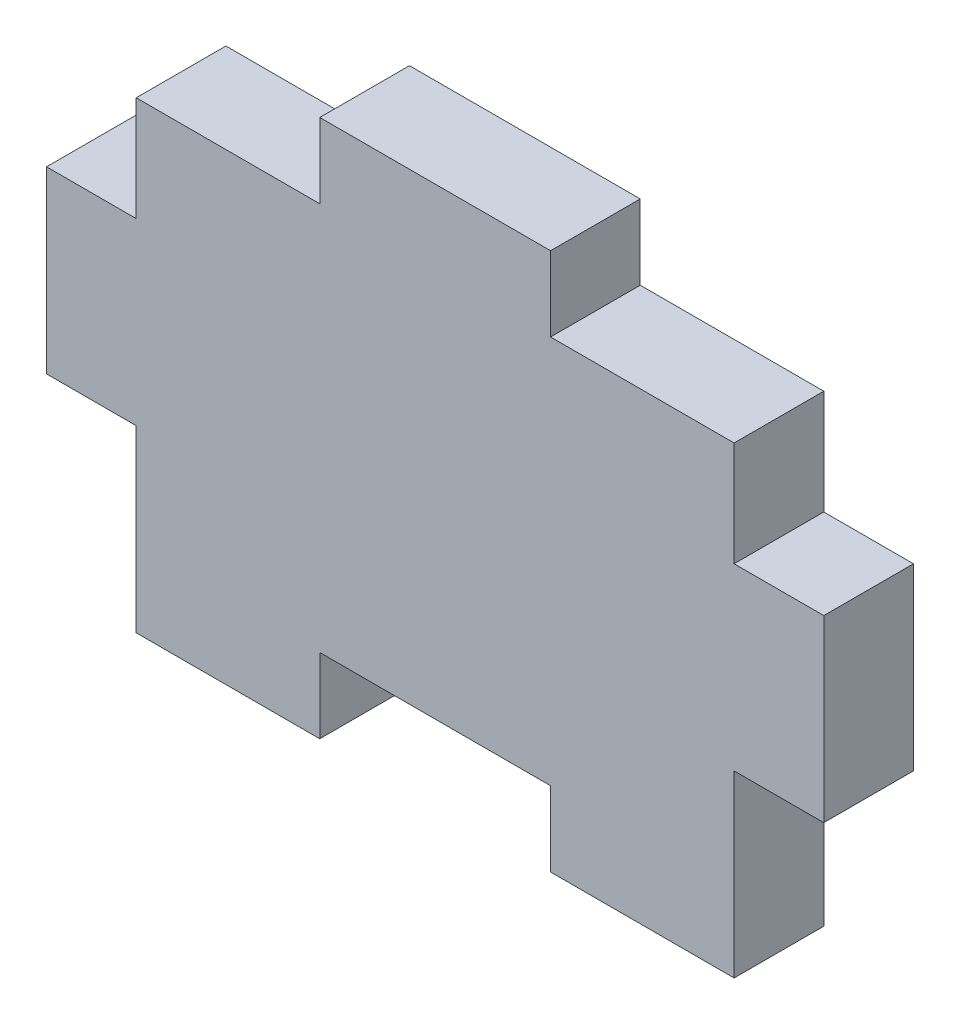
ISO-10303-21;
HEADER;
FILE_DESCRIPTION(('STEP AP214'),'2;1');
FILE_NAME('part.step','',(''),(''),'','','');
FILE_SCHEMA(('AUTOMOTIVE_DESIGN { 1 0 10303 214 1 1 1 1 }'));
ENDSEC;
DATA;
#1=APPLICATION_CONTEXT('core data for automotive mechanical design processes');
#2=APPLICATION_PROTOCOL_DEFINITION('international standard','automotive_design',2000,#1);
#3=PRODUCT_CONTEXT('',#1,'mechanical');
#4=PRODUCT('Part','Part','',(#3));
#5=PRODUCT_RELATED_PRODUCT_CATEGORY('part','',(#4));
#6=PRODUCT_DEFINITION_FORMATION('','',#4);
#7=PRODUCT_DEFINITION_CONTEXT('part definition',#1,'design');
#8=PRODUCT_DEFINITION('design','',#6,#7);
#9=PRODUCT_DEFINITION_SHAPE('','',#8);
#10=(LENGTH_UNIT() NAMED_UNIT(*) SI_UNIT(.MILLI.,.METRE.));
#11=(NAMED_UNIT(*) PLANE_ANGLE_UNIT() SI_UNIT($,.RADIAN.));
#12=(NAMED_UNIT(*) SI_UNIT($,.STERADIAN.) SOLID_ANGLE_UNIT());
#13=UNCERTAINTY_MEASURE_WITH_UNIT(LENGTH_MEASURE(1.E-05),#10,'distance_accuracy_value','');
#14=(GEOMETRIC_REPRESENTATION_CONTEXT(3) GLOBAL_UNCERTAINTY_ASSIGNED_CONTEXT((#13)) GLOBAL_UNIT_ASSIGNED_CONTEXT((#10,
#11,#12)) REPRESENTATION_CONTEXT('',''));
#15=CARTESIAN_POINT('',(0.,0.,0.));
#16=DIRECTION('',(0.,0.,1.));
#17=DIRECTION('',(1.,0.,0.));
#18=AXIS2_PLACEMENT_3D('',#15,#16,#17);
#19=CARTESIAN_POINT('',(-10.,11.3810935461449,3.));
#20=DIRECTION('',(-1.,0.,0.));
#21=DIRECTION('',(0.,-1.,0.));
#22=AXIS2_PLACEMENT_3D('',#19,#20,#21);
#23=PLANE('',#22);
#24=DIRECTION('',(0.,1.,0.));
#25=VECTOR('',#24,1.);
#26=CARTESIAN_POINT('',(-10.,11.3810935461449,0.));
#27=LINE('',#26,#25);
#28=CARTESIAN_POINT('',(-10.,11.3810935461449,0.));
#29=VERTEX_POINT('',#28);
#30=CARTESIAN_POINT('',(-10.,14.8810935461449,0.));
#31=VERTEX_POINT('',#30);
#32=EDGE_CURVE('E213',#29,#31,#27,.T.);
#33=ORIENTED_EDGE('',*,*,#32,.F.);
#34=DIRECTION('',(0.,0.,-1.));
#35=VECTOR('',#34,1.);
#36=CARTESIAN_POINT('',(-10.,11.3810935461449,3.));
#37=LINE('',#36,#35);
#38=CARTESIAN_POINT('',(-10.,11.3810935461449,3.));
#39=VERTEX_POINT('',#38);
#40=EDGE_CURVE('E11',#39,#29,#37,.T.);
#41=ORIENTED_EDGE('',*,*,#40,.F.);
#42=DIRECTION('',(0.,1.,0.));
#43=VECTOR('',#42,1.);
#44=CARTESIAN_POINT('',(-10.,11.3810935461449,3.));
#45=LINE('',#44,#43);
#46=CARTESIAN_POINT('',(-10.,14.8810935461449,3.));
#47=VERTEX_POINT('',#46);
#48=EDGE_CURVE('E283',#39,#47,#45,.T.);
#49=ORIENTED_EDGE('',*,*,#48,.T.);
#50=DIRECTION('',(0.,0.,-1.));
#51=VECTOR('',#50,1.);
#52=CARTESIAN_POINT('',(-10.,14.8810935461449,3.));
#53=LINE('',#52,#51);
#54=EDGE_CURVE('E44',#47,#31,#53,.T.);
#55=ORIENTED_EDGE('',*,*,#54,.T.);
#56=EDGE_LOOP('',(#33,#41,#49,#55));
#57=FACE_BOUND('',#56,.T.);
#58=ADVANCED_FACE('F41',(#57),#23,.T.);
#59=CARTESIAN_POINT('',(-13.,11.3810935461449,3.));
#60=DIRECTION('',(0.,1.,0.));
#61=DIRECTION('',(0.,0.,1.));
#62=AXIS2_PLACEMENT_3D('',#59,#60,#61);
#63=PLANE('',#62);
#64=DIRECTION('',(1.,0.,0.));
#65=VECTOR('',#64,1.);
#66=CARTESIAN_POINT('',(-13.,11.3810935461449,0.));
#67=LINE('',#66,#65);
#68=CARTESIAN_POINT('',(-13.,11.3810935461449,0.));
#69=VERTEX_POINT('',#68);
#70=EDGE_CURVE('E280',#69,#29,#67,.T.);
#71=ORIENTED_EDGE('',*,*,#70,.F.);
#72=DIRECTION('',(0.,0.,-1.));
#73=VECTOR('',#72,1.);
#74=CARTESIAN_POINT('',(-13.,11.3810935461449,3.));
#75=LINE('',#74,#73);
#76=CARTESIAN_POINT('',(-13.,11.3810935461449,3.));
#77=VERTEX_POINT('',#76);
#78=EDGE_CURVE('E51',#77,#69,#75,.T.);
#79=ORIENTED_EDGE('',*,*,#78,.F.);
#80=DIRECTION('',(1.,0.,0.));
#81=VECTOR('',#80,1.);
#82=CARTESIAN_POINT('',(-13.,11.3810935461449,3.));
#83=LINE('',#82,#81);
#84=EDGE_CURVE('E206',#77,#39,#83,.T.);
#85=ORIENTED_EDGE('',*,*,#84,.T.);
#86=ORIENTED_EDGE('',*,*,#40,.T.);
#87=EDGE_LOOP('',(#71,#79,#85,#86));
#88=FACE_BOUND('',#87,.T.);
#89=ADVANCED_FACE('F343',(#88),#63,.T.);
#90=CARTESIAN_POINT('',(-13.,5.3810935461449,3.));
#91=DIRECTION('',(-1.,0.,0.));
#92=DIRECTION('',(0.,0.,1.));
#93=AXIS2_PLACEMENT_3D('',#90,#91,#92);
#94=PLANE('',#93);
#95=DIRECTION('',(0.,1.,0.));
#96=VECTOR('',#95,1.);
#97=CARTESIAN_POINT('',(-13.,5.3810935461449,0.));
#98=LINE('',#97,#96);
#99=CARTESIAN_POINT('',(-13.,5.3810935461449,0.));
#100=VERTEX_POINT('',#99);
#101=EDGE_CURVE('E189',#100,#69,#98,.T.);
#102=ORIENTED_EDGE('',*,*,#101,.F.);
#103=DIRECTION('',(0.,0.,-1.));
#104=VECTOR('',#103,1.);
#105=CARTESIAN_POINT('',(-13.,5.3810935461449,3.));
#106=LINE('',#105,#104);
#107=CARTESIAN_POINT('',(-13.,5.3810935461449,3.));
#108=VERTEX_POINT('',#107);
#109=EDGE_CURVE('E183',#108,#100,#106,.T.);
#110=ORIENTED_EDGE('',*,*,#109,.F.);
#111=DIRECTION('',(0.,1.,0.));
#112=VECTOR('',#111,1.);
#113=CARTESIAN_POINT('',(-13.,5.3810935461449,3.));
#114=LINE('',#113,#112);
#115=EDGE_CURVE('E187',#108,#77,#114,.T.);
#116=ORIENTED_EDGE('',*,*,#115,.T.);
#117=ORIENTED_EDGE('',*,*,#78,.T.);
#118=EDGE_LOOP('',(#102,#110,#116,#117));
#119=FACE_BOUND('',#118,.T.);
#120=ADVANCED_FACE('F185',(#119),#94,.T.);
#121=CARTESIAN_POINT('',(-13.,5.3810935461449,3.));
#122=DIRECTION('',(0.,1.,0.));
#123=DIRECTION('',(-1.,0.,0.));
#124=AXIS2_PLACEMENT_3D('',#121,#122,#123);
#125=PLANE('',#124);
#126=DIRECTION('',(1.,0.,0.));
#127=VECTOR('',#126,1.);
#128=CARTESIAN_POINT('',(-13.,5.3810935461449,0.));
#129=LINE('',#128,#127);
#130=CARTESIAN_POINT('',(-10.,5.3810935461449,0.));
#131=VERTEX_POINT('',#130);
#132=EDGE_CURVE('E275',#100,#131,#129,.T.);
#133=ORIENTED_EDGE('',*,*,#132,.T.);
#134=DIRECTION('',(0.,0.,-1.));
#135=VECTOR('',#134,1.);
#136=CARTESIAN_POINT('',(-10.,5.3810935461449,3.));
#137=LINE('',#136,#135);
#138=CARTESIAN_POINT('',(-10.,5.3810935461449,3.));
#139=VERTEX_POINT('',#138);
#140=EDGE_CURVE('E194',#139,#131,#137,.T.);
#141=ORIENTED_EDGE('',*,*,#140,.F.);
#142=DIRECTION('',(1.,0.,0.));
#143=VECTOR('',#142,1.);
#144=CARTESIAN_POINT('',(-13.,5.3810935461449,3.));
#145=LINE('',#144,#143);
#146=EDGE_CURVE('E197',#108,#139,#145,.T.);
#147=ORIENTED_EDGE('',*,*,#146,.F.);
#148=ORIENTED_EDGE('',*,*,#109,.T.);
#149=EDGE_LOOP('',(#133,#141,#147,#148));
#150=FACE_BOUND('',#149,.T.);
#151=ADVANCED_FACE('F198',(#150),#125,.F.);
#152=CARTESIAN_POINT('',(-10.,-0.618906453855102,3.));
#153=DIRECTION('',(-1.,0.,0.));
#154=DIRECTION('',(0.,0.,1.));
#155=AXIS2_PLACEMENT_3D('',#152,#153,#154);
#156=PLANE('',#155);
#157=DIRECTION('',(0.,1.,0.));
#158=VECTOR('',#157,1.);
#159=CARTESIAN_POINT('',(-10.,-0.618906453855102,0.));
#160=LINE('',#159,#158);
#161=CARTESIAN_POINT('',(-10.,-0.618906453855102,0.));
#162=VERTEX_POINT('',#161);
#163=EDGE_CURVE('E271',#162,#131,#160,.T.);
#164=ORIENTED_EDGE('',*,*,#163,.F.);
#165=DIRECTION('',(0.,0.,-1.));
#166=VECTOR('',#165,1.);
#167=CARTESIAN_POINT('',(-10.,-0.618906453855102,3.));
#168=LINE('',#167,#166);
#169=CARTESIAN_POINT('',(-10.,-0.618906453855102,3.));
#170=VERTEX_POINT('',#169);
#171=EDGE_CURVE('E289',#170,#162,#168,.T.);
#172=ORIENTED_EDGE('',*,*,#171,.F.);
#173=DIRECTION('',(0.,1.,0.));
#174=VECTOR('',#173,1.);
#175=CARTESIAN_POINT('',(-10.,-0.618906453855102,3.));
#176=LINE('',#175,#174);
#177=EDGE_CURVE('E203',#170,#139,#176,.T.);
#178=ORIENTED_EDGE('',*,*,#177,.T.);
#179=ORIENTED_EDGE('',*,*,#140,.T.);
#180=EDGE_LOOP('',(#164,#172,#178,#179));
#181=FACE_BOUND('',#180,.T.);
#182=ADVANCED_FACE('F356',(#181),#156,.T.);
#183=CARTESIAN_POINT('',(-3.86019023383633,-0.6189064538551,3.));
#184=DIRECTION('',(0.,-1.,0.));
#185=DIRECTION('',(1.,0.,0.));
#186=AXIS2_PLACEMENT_3D('',#183,#184,#185);
#187=PLANE('',#186);
#188=DIRECTION('',(-1.,0.,0.));
#189=VECTOR('',#188,1.);
#190=CARTESIAN_POINT('',(-3.86019023383633,-0.6189064538551,0.));
#191=LINE('',#190,#189);
#192=CARTESIAN_POINT('',(-3.86019023383633,-0.6189064538551,0.));
#193=VERTEX_POINT('',#192);
#194=EDGE_CURVE('E267',#193,#162,#191,.T.);
#195=ORIENTED_EDGE('',*,*,#194,.F.);
#196=DIRECTION('',(0.,0.,-1.));
#197=VECTOR('',#196,1.);
#198=CARTESIAN_POINT('',(-3.86019023383633,-0.6189064538551,3.));
#199=LINE('',#198,#197);
#200=CARTESIAN_POINT('',(-3.86019023383633,-0.6189064538551,3.));
#201=VERTEX_POINT('',#200);
#202=EDGE_CURVE('E292',#201,#193,#199,.T.);
#203=ORIENTED_EDGE('',*,*,#202,.F.);
#204=DIRECTION('',(-1.,0.,0.));
#205=VECTOR('',#204,1.);
#206=CARTESIAN_POINT('',(-3.86019023383633,-0.6189064538551,3.));
#207=LINE('',#206,#205);
#208=EDGE_CURVE('E598',#201,#170,#207,.T.);
#209=ORIENTED_EDGE('',*,*,#208,.T.);
#210=ORIENTED_EDGE('',*,*,#171,.T.);
#211=EDGE_LOOP('',(#195,#203,#209,#210));
#212=FACE_BOUND('',#211,.T.);
#213=ADVANCED_FACE('F359',(#212),#187,.T.);
#214=CARTESIAN_POINT('',(-3.86019023383633,-0.6189064538551,3.));
#215=DIRECTION('',(-1.,0.,0.));
#216=DIRECTION('',(0.,-1.,0.));
#217=AXIS2_PLACEMENT_3D('',#214,#215,#216);
#218=PLANE('',#217);
#219=DIRECTION('',(0.,1.,0.));
#220=VECTOR('',#219,1.);
#221=CARTESIAN_POINT('',(-3.86019023383633,-0.6189064538551,0.));
#222=LINE('',#221,#220);
#223=CARTESIAN_POINT('',(-3.86019023383633,1.8810935461449,0.));
#224=VERTEX_POINT('',#223);
#225=EDGE_CURVE('E263',#193,#224,#222,.T.);
#226=ORIENTED_EDGE('',*,*,#225,.T.);
#227=DIRECTION('',(0.,0.,-1.));
#228=VECTOR('',#227,1.);
#229=CARTESIAN_POINT('',(-3.86019023383633,1.8810935461449,3.));
#230=LINE('',#229,#228);
#231=CARTESIAN_POINT('',(-3.86019023383633,1.8810935461449,3.));
#232=VERTEX_POINT('',#231);
#233=EDGE_CURVE('E295',#232,#224,#230,.T.);
#234=ORIENTED_EDGE('',*,*,#233,.F.);
#235=DIRECTION('',(0.,1.,0.));
#236=VECTOR('',#235,1.);
#237=CARTESIAN_POINT('',(-3.86019023383633,-0.6189064538551,3.));
#238=LINE('',#237,#236);
#239=EDGE_CURVE('E601',#201,#232,#238,.T.);
#240=ORIENTED_EDGE('',*,*,#239,.F.);
#241=ORIENTED_EDGE('',*,*,#202,.T.);
#242=EDGE_LOOP('',(#226,#234,#240,#241));
#243=FACE_BOUND('',#242,.T.);
#244=ADVANCED_FACE('F363',(#243),#218,.F.);
#245=CARTESIAN_POINT('',(3.86019023383633,1.8810935461449,3.));
#246=DIRECTION('',(0.,-1.,0.));
#247=DIRECTION('',(0.,0.,-1.));
#248=AXIS2_PLACEMENT_3D('',#245,#246,#247);
#249=PLANE('',#248);
#250=DIRECTION('',(-1.,0.,0.));
#251=VECTOR('',#250,1.);
#252=CARTESIAN_POINT('',(3.86019023383633,1.8810935461449,0.));
#253=LINE('',#252,#251);
#254=CARTESIAN_POINT('',(3.86019023383633,1.8810935461449,0.));
#255=VERTEX_POINT('',#254);
#256=EDGE_CURVE('E259',#255,#224,#253,.T.);
#257=ORIENTED_EDGE('',*,*,#256,.F.);
#258=DIRECTION('',(0.,0.,-1.));
#259=VECTOR('',#258,1.);
#260=CARTESIAN_POINT('',(3.86019023383633,1.8810935461449,3.));
#261=LINE('',#260,#259);
#262=CARTESIAN_POINT('',(3.86019023383633,1.8810935461449,3.));
#263=VERTEX_POINT('',#262);
#264=EDGE_CURVE('E298',#263,#255,#261,.T.);
#265=ORIENTED_EDGE('',*,*,#264,.F.);
#266=DIRECTION('',(-1.,0.,0.));
#267=VECTOR('',#266,1.);
#268=CARTESIAN_POINT('',(3.86019023383633,1.8810935461449,3.));
#269=LINE('',#268,#267);
#270=EDGE_CURVE('E606',#263,#232,#269,.T.);
#271=ORIENTED_EDGE('',*,*,#270,.T.);
#272=ORIENTED_EDGE('',*,*,#233,.T.);
#273=EDGE_LOOP('',(#257,#265,#271,#272));
#274=FACE_BOUND('',#273,.T.);
#275=ADVANCED_FACE('F367',(#274),#249,.T.);
#276=CARTESIAN_POINT('',(3.86019023383633,-0.618906453855099,3.));
#277=DIRECTION('',(-1.,0.,0.));
#278=DIRECTION('',(0.,0.,1.));
#279=AXIS2_PLACEMENT_3D('',#276,#277,#278);
#280=PLANE('',#279);
#281=DIRECTION('',(0.,1.,0.));
#282=VECTOR('',#281,1.);
#283=CARTESIAN_POINT('',(3.86019023383633,-0.618906453855099,0.));
#284=LINE('',#283,#282);
#285=CARTESIAN_POINT('',(3.86019023383633,-0.618906453855099,0.));
#286=VERTEX_POINT('',#285);
#287=EDGE_CURVE('E255',#286,#255,#284,.T.);
#288=ORIENTED_EDGE('',*,*,#287,.F.);
#289=DIRECTION('',(0.,0.,-1.));
#290=VECTOR('',#289,1.);
#291=CARTESIAN_POINT('',(3.86019023383633,-0.618906453855099,3.));
#292=LINE('',#291,#290);
#293=CARTESIAN_POINT('',(3.86019023383633,-0.618906453855099,3.));
#294=VERTEX_POINT('',#293);
#295=EDGE_CURVE('E301',#294,#286,#292,.T.);
#296=ORIENTED_EDGE('',*,*,#295,.F.);
#297=DIRECTION('',(0.,1.,0.));
#298=VECTOR('',#297,1.);
#299=CARTESIAN_POINT('',(3.86019023383633,-0.618906453855099,3.));
#300=LINE('',#299,#298);
#301=EDGE_CURVE('E588',#294,#263,#300,.T.);
#302=ORIENTED_EDGE('',*,*,#301,.T.);
#303=ORIENTED_EDGE('',*,*,#264,.T.);
#304=EDGE_LOOP('',(#288,#296,#302,#303));
#305=FACE_BOUND('',#304,.T.);
#306=ADVANCED_FACE('F371',(#305),#280,.T.);
#307=CARTESIAN_POINT('',(3.86019023383633,-0.618906453855099,3.));
#308=DIRECTION('',(0.,1.,0.));
#309=DIRECTION('',(0.,0.,1.));
#310=AXIS2_PLACEMENT_3D('',#307,#308,#309);
#311=PLANE('',#310);
#312=DIRECTION('',(1.,0.,0.));
#313=VECTOR('',#312,1.);
#314=CARTESIAN_POINT('',(3.86019023383633,-0.618906453855099,0.));
#315=LINE('',#314,#313);
#316=CARTESIAN_POINT('',(10.,-0.618906453855099,0.));
#317=VERTEX_POINT('',#316);
#318=EDGE_CURVE('E252',#286,#317,#315,.T.);
#319=ORIENTED_EDGE('',*,*,#318,.T.);
#320=DIRECTION('',(0.,0.,-1.));
#321=VECTOR('',#320,1.);
#322=CARTESIAN_POINT('',(10.,-0.618906453855099,3.));
#323=LINE('',#322,#321);
#324=CARTESIAN_POINT('',(10.,-0.618906453855099,3.));
#325=VERTEX_POINT('',#324);
#326=EDGE_CURVE('E304',#325,#317,#323,.T.);
#327=ORIENTED_EDGE('',*,*,#326,.F.);
#328=DIRECTION('',(1.,0.,0.));
#329=VECTOR('',#328,1.);
#330=CARTESIAN_POINT('',(3.86019023383633,-0.618906453855099,3.));
#331=LINE('',#330,#329);
#332=EDGE_CURVE('E611',#294,#325,#331,.T.);
#333=ORIENTED_EDGE('',*,*,#332,.F.);
#334=ORIENTED_EDGE('',*,*,#295,.T.);
#335=EDGE_LOOP('',(#319,#327,#333,#334));
#336=FACE_BOUND('',#335,.T.);
#337=ADVANCED_FACE('F375',(#336),#311,.F.);
#338=CARTESIAN_POINT('',(10.,-0.618906453855099,3.));
#339=DIRECTION('',(-1.,0.,0.));
#340=DIRECTION('',(0.,0.,1.));
#341=AXIS2_PLACEMENT_3D('',#338,#339,#340);
#342=PLANE('',#341);
#343=DIRECTION('',(0.,1.,0.));
#344=VECTOR('',#343,1.);
#345=CARTESIAN_POINT('',(10.,-0.618906453855099,0.));
#346=LINE('',#345,#344);
#347=CARTESIAN_POINT('',(10.,5.3810935461449,0.));
#348=VERTEX_POINT('',#347);
#349=EDGE_CURVE('E248',#317,#348,#346,.T.);
#350=ORIENTED_EDGE('',*,*,#349,.T.);
#351=DIRECTION('',(0.,0.,-1.));
#352=VECTOR('',#351,1.);
#353=CARTESIAN_POINT('',(10.,5.3810935461449,3.));
#354=LINE('',#353,#352);
#355=CARTESIAN_POINT('',(10.,5.3810935461449,3.));
#356=VERTEX_POINT('',#355);
#357=EDGE_CURVE('E308',#356,#348,#354,.T.);
#358=ORIENTED_EDGE('',*,*,#357,.F.);
#359=DIRECTION('',(0.,1.,0.));
#360=VECTOR('',#359,1.);
#361=CARTESIAN_POINT('',(10.,-0.618906453855099,3.));
#362=LINE('',#361,#360);
#363=EDGE_CURVE('E614',#325,#356,#362,.T.);
#364=ORIENTED_EDGE('',*,*,#363,.F.);
#365=ORIENTED_EDGE('',*,*,#326,.T.);
#366=EDGE_LOOP('',(#350,#358,#364,#365));
#367=FACE_BOUND('',#366,.T.);
#368=ADVANCED_FACE('F379',(#367),#342,.F.);
#369=CARTESIAN_POINT('',(13.,5.3810935461449,3.));
#370=DIRECTION('',(0.,-1.,0.));
#371=DIRECTION('',(1.,0.,0.));
#372=AXIS2_PLACEMENT_3D('',#369,#370,#371);
#373=PLANE('',#372);
#374=DIRECTION('',(-1.,0.,0.));
#375=VECTOR('',#374,1.);
#376=CARTESIAN_POINT('',(13.,5.3810935461449,0.));
#377=LINE('',#376,#375);
#378=CARTESIAN_POINT('',(13.,5.3810935461449,0.));
#379=VERTEX_POINT('',#378);
#380=EDGE_CURVE('E244',#379,#348,#377,.T.);
#381=ORIENTED_EDGE('',*,*,#380,.F.);
#382=DIRECTION('',(0.,0.,-1.));
#383=VECTOR('',#382,1.);
#384=CARTESIAN_POINT('',(13.,5.3810935461449,3.));
#385=LINE('',#384,#383);
#386=CARTESIAN_POINT('',(13.,5.3810935461449,3.));
#387=VERTEX_POINT('',#386);
#388=EDGE_CURVE('E311',#387,#379,#385,.T.);
#389=ORIENTED_EDGE('',*,*,#388,.F.);
#390=DIRECTION('',(-1.,0.,0.));
#391=VECTOR('',#390,1.);
#392=CARTESIAN_POINT('',(13.,5.3810935461449,3.));
#393=LINE('',#392,#391);
#394=EDGE_CURVE('E579',#387,#356,#393,.T.);
#395=ORIENTED_EDGE('',*,*,#394,.T.);
#396=ORIENTED_EDGE('',*,*,#357,.T.);
#397=EDGE_LOOP('',(#381,#389,#395,#396));
#398=FACE_BOUND('',#397,.T.);
#399=ADVANCED_FACE('F383',(#398),#373,.T.);
#400=CARTESIAN_POINT('',(13.,5.3810935461449,3.));
#401=DIRECTION('',(-1.,0.,0.));
#402=DIRECTION('',(0.,0.,1.));
#403=AXIS2_PLACEMENT_3D('',#400,#401,#402);
#404=PLANE('',#403);
#405=DIRECTION('',(0.,1.,0.));
#406=VECTOR('',#405,1.);
#407=CARTESIAN_POINT('',(13.,5.3810935461449,0.));
#408=LINE('',#407,#406);
#409=CARTESIAN_POINT('',(13.,11.3810935461449,0.));
#410=VERTEX_POINT('',#409);
#411=EDGE_CURVE('E241',#379,#410,#408,.T.);
#412=ORIENTED_EDGE('',*,*,#411,.T.);
#413=DIRECTION('',(0.,0.,-1.));
#414=VECTOR('',#413,1.);
#415=CARTESIAN_POINT('',(13.,11.3810935461449,3.));
#416=LINE('',#415,#414);
#417=CARTESIAN_POINT('',(13.,11.3810935461449,3.));
#418=VERTEX_POINT('',#417);
#419=EDGE_CURVE('E314',#418,#410,#416,.T.);
#420=ORIENTED_EDGE('',*,*,#419,.F.);
#421=DIRECTION('',(0.,1.,0.));
#422=VECTOR('',#421,1.);
#423=CARTESIAN_POINT('',(13.,5.3810935461449,3.));
#424=LINE('',#423,#422);
#425=EDGE_CURVE('E573',#387,#418,#424,.T.);
#426=ORIENTED_EDGE('',*,*,#425,.F.);
#427=ORIENTED_EDGE('',*,*,#388,.T.);
#428=EDGE_LOOP('',(#412,#420,#426,#427));
#429=FACE_BOUND('',#428,.T.);
#430=ADVANCED_FACE('F387',(#429),#404,.F.);
#431=CARTESIAN_POINT('',(13.,11.3810935461449,3.));
#432=DIRECTION('',(0.,-1.,0.));
#433=DIRECTION('',(1.,0.,0.));
#434=AXIS2_PLACEMENT_3D('',#431,#432,#433);
#435=PLANE('',#434);
#436=DIRECTION('',(-1.,0.,0.));
#437=VECTOR('',#436,1.);
#438=CARTESIAN_POINT('',(13.,11.3810935461449,0.));
#439=LINE('',#438,#437);
#440=CARTESIAN_POINT('',(10.,11.3810935461449,0.));
#441=VERTEX_POINT('',#440);
#442=EDGE_CURVE('E238',#410,#441,#439,.T.);
#443=ORIENTED_EDGE('',*,*,#442,.T.);
#444=DIRECTION('',(0.,0.,-1.));
#445=VECTOR('',#444,1.);
#446=CARTESIAN_POINT('',(10.,11.3810935461449,3.));
#447=LINE('',#446,#445);
#448=CARTESIAN_POINT('',(10.,11.3810935461449,3.));
#449=VERTEX_POINT('',#448);
#450=EDGE_CURVE('E318',#449,#441,#447,.T.);
#451=ORIENTED_EDGE('',*,*,#450,.F.);
#452=DIRECTION('',(-1.,0.,0.));
#453=VECTOR('',#452,1.);
#454=CARTESIAN_POINT('',(13.,11.3810935461449,3.));
#455=LINE('',#454,#453);
#456=EDGE_CURVE('E570',#418,#449,#455,.T.);
#457=ORIENTED_EDGE('',*,*,#456,.F.);
#458=ORIENTED_EDGE('',*,*,#419,.T.);
#459=EDGE_LOOP('',(#443,#451,#457,#458));
#460=FACE_BOUND('',#459,.T.);
#461=ADVANCED_FACE('F391',(#460),#435,.F.);
#462=CARTESIAN_POINT('',(10.,11.3810935461449,3.));
#463=DIRECTION('',(-1.,0.,0.));
#464=DIRECTION('',(0.,0.,1.));
#465=AXIS2_PLACEMENT_3D('',#462,#463,#464);
#466=PLANE('',#465);
#467=DIRECTION('',(0.,1.,0.));
#468=VECTOR('',#467,1.);
#469=CARTESIAN_POINT('',(10.,11.3810935461449,0.));
#470=LINE('',#469,#468);
#471=CARTESIAN_POINT('',(10.,14.8810935461449,0.));
#472=VERTEX_POINT('',#471);
#473=EDGE_CURVE('E235',#441,#472,#470,.T.);
#474=ORIENTED_EDGE('',*,*,#473,.T.);
#475=DIRECTION('',(0.,0.,-1.));
#476=VECTOR('',#475,1.);
#477=CARTESIAN_POINT('',(10.,14.8810935461449,3.));
#478=LINE('',#477,#476);
#479=CARTESIAN_POINT('',(10.,14.8810935461449,3.));
#480=VERTEX_POINT('',#479);
#481=EDGE_CURVE('E322',#480,#472,#478,.T.);
#482=ORIENTED_EDGE('',*,*,#481,.F.);
#483=DIRECTION('',(0.,1.,0.));
#484=VECTOR('',#483,1.);
#485=CARTESIAN_POINT('',(10.,11.3810935461449,3.));
#486=LINE('',#485,#484);
#487=EDGE_CURVE('E568',#449,#480,#486,.T.);
#488=ORIENTED_EDGE('',*,*,#487,.F.);
#489=ORIENTED_EDGE('',*,*,#450,.T.);
#490=EDGE_LOOP('',(#474,#482,#488,#489));
#491=FACE_BOUND('',#490,.T.);
#492=ADVANCED_FACE('F395',(#491),#466,.F.);
#493=CARTESIAN_POINT('',(10.,14.8810935461449,3.));
#494=DIRECTION('',(0.,-1.,0.));
#495=DIRECTION('',(1.,0.,0.));
#496=AXIS2_PLACEMENT_3D('',#493,#494,#495);
#497=PLANE('',#496);
#498=DIRECTION('',(-1.,0.,0.));
#499=VECTOR('',#498,1.);
#500=CARTESIAN_POINT('',(10.,14.8810935461449,0.));
#501=LINE('',#500,#499);
#502=CARTESIAN_POINT('',(3.86019023383633,14.8810935461449,0.));
#503=VERTEX_POINT('',#502);
#504=EDGE_CURVE('E232',#472,#503,#501,.T.);
#505=ORIENTED_EDGE('',*,*,#504,.T.);
#506=DIRECTION('',(0.,0.,-1.));
#507=VECTOR('',#506,1.);
#508=CARTESIAN_POINT('',(3.86019023383633,14.8810935461449,3.));
#509=LINE('',#508,#507);
#510=CARTESIAN_POINT('',(3.86019023383633,14.8810935461449,3.));
#511=VERTEX_POINT('',#510);
#512=EDGE_CURVE('E326',#511,#503,#509,.T.);
#513=ORIENTED_EDGE('',*,*,#512,.F.);
#514=DIRECTION('',(-1.,0.,0.));
#515=VECTOR('',#514,1.);
#516=CARTESIAN_POINT('',(10.,14.8810935461449,3.));
#517=LINE('',#516,#515);
#518=EDGE_CURVE('E561',#480,#511,#517,.T.);
#519=ORIENTED_EDGE('',*,*,#518,.F.);
#520=ORIENTED_EDGE('',*,*,#481,.T.);
#521=EDGE_LOOP('',(#505,#513,#519,#520));
#522=FACE_BOUND('',#521,.T.);
#523=ADVANCED_FACE('F399',(#522),#497,.F.);
#524=CARTESIAN_POINT('',(3.86019023383633,14.8810935461449,3.));
#525=DIRECTION('',(-1.,0.,0.));
#526=DIRECTION('',(0.,0.,1.));
#527=AXIS2_PLACEMENT_3D('',#524,#525,#526);
#528=PLANE('',#527);
#529=DIRECTION('',(0.,1.,0.));
#530=VECTOR('',#529,1.);
#531=CARTESIAN_POINT('',(3.86019023383633,14.8810935461449,0.));
#532=LINE('',#531,#530);
#533=CARTESIAN_POINT('',(3.86019023383633,17.3810935461449,0.));
#534=VERTEX_POINT('',#533);
#535=EDGE_CURVE('E229',#503,#534,#532,.T.);
#536=ORIENTED_EDGE('',*,*,#535,.T.);
#537=DIRECTION('',(0.,0.,-1.));
#538=VECTOR('',#537,1.);
#539=CARTESIAN_POINT('',(3.86019023383633,17.3810935461449,3.));
#540=LINE('',#539,#538);
#541=CARTESIAN_POINT('',(3.86019023383633,17.3810935461449,3.));
#542=VERTEX_POINT('',#541);
#543=EDGE_CURVE('E330',#542,#534,#540,.T.);
#544=ORIENTED_EDGE('',*,*,#543,.F.);
#545=DIRECTION('',(0.,1.,0.));
#546=VECTOR('',#545,1.);
#547=CARTESIAN_POINT('',(3.86019023383633,14.8810935461449,3.));
#548=LINE('',#547,#546);
#549=EDGE_CURVE('E558',#511,#542,#548,.T.);
#550=ORIENTED_EDGE('',*,*,#549,.F.);
#551=ORIENTED_EDGE('',*,*,#512,.T.);
#552=EDGE_LOOP('',(#536,#544,#550,#551));
#553=FACE_BOUND('',#552,.T.);
#554=ADVANCED_FACE('F403',(#553),#528,.F.);
#555=CARTESIAN_POINT('',(3.86019023383633,17.3810935461449,3.));
#556=DIRECTION('',(0.,-1.,0.));
#557=DIRECTION('',(0.,0.,-1.));
#558=AXIS2_PLACEMENT_3D('',#555,#556,#557);
#559=PLANE('',#558);
#560=DIRECTION('',(-1.,0.,0.));
#561=VECTOR('',#560,1.);
#562=CARTESIAN_POINT('',(3.86019023383633,17.3810935461449,0.));
#563=LINE('',#562,#561);
#564=CARTESIAN_POINT('',(-3.86019023383633,17.3810935461449,0.));
#565=VERTEX_POINT('',#564);
#566=EDGE_CURVE('E225',#534,#565,#563,.T.);
#567=ORIENTED_EDGE('',*,*,#566,.T.);
#568=DIRECTION('',(0.,0.,-1.));
#569=VECTOR('',#568,1.);
#570=CARTESIAN_POINT('',(-3.86019023383633,17.3810935461449,3.));
#571=LINE('',#570,#569);
#572=CARTESIAN_POINT('',(-3.86019023383633,17.3810935461449,3.));
#573=VERTEX_POINT('',#572);
#574=EDGE_CURVE('E334',#573,#565,#571,.T.);
#575=ORIENTED_EDGE('',*,*,#574,.F.);
#576=DIRECTION('',(-1.,0.,0.));
#577=VECTOR('',#576,1.);
#578=CARTESIAN_POINT('',(3.86019023383633,17.3810935461449,3.));
#579=LINE('',#578,#577);
#580=EDGE_CURVE('E556',#542,#573,#579,.T.);
#581=ORIENTED_EDGE('',*,*,#580,.F.);
#582=ORIENTED_EDGE('',*,*,#543,.T.);
#583=EDGE_LOOP('',(#567,#575,#581,#582));
#584=FACE_BOUND('',#583,.T.);
#585=ADVANCED_FACE('F407',(#584),#559,.F.);
#586=CARTESIAN_POINT('',(-3.86019023383633,14.8810935461449,3.));
#587=DIRECTION('',(-1.,0.,0.));
#588=DIRECTION('',(0.,-1.,0.));
#589=AXIS2_PLACEMENT_3D('',#586,#587,#588);
#590=PLANE('',#589);
#591=DIRECTION('',(0.,1.,0.));
#592=VECTOR('',#591,1.);
#593=CARTESIAN_POINT('',(-3.86019023383633,14.8810935461449,0.));
#594=LINE('',#593,#592);
#595=CARTESIAN_POINT('',(-3.86019023383633,14.8810935461449,0.));
#596=VERTEX_POINT('',#595);
#597=EDGE_CURVE('E221',#596,#565,#594,.T.);
#598=ORIENTED_EDGE('',*,*,#597,.F.);
#599=DIRECTION('',(0.,0.,-1.));
#600=VECTOR('',#599,1.);
#601=CARTESIAN_POINT('',(-3.86019023383633,14.8810935461449,3.));
#602=LINE('',#601,#600);
#603=CARTESIAN_POINT('',(-3.86019023383633,14.8810935461449,3.));
#604=VERTEX_POINT('',#603);
#605=EDGE_CURVE('E336',#604,#596,#602,.T.);
#606=ORIENTED_EDGE('',*,*,#605,.F.);
#607=DIRECTION('',(0.,1.,0.));
#608=VECTOR('',#607,1.);
#609=CARTESIAN_POINT('',(-3.86019023383633,14.8810935461449,3.));
#610=LINE('',#609,#608);
#611=EDGE_CURVE('E631',#604,#573,#610,.T.);
#612=ORIENTED_EDGE('',*,*,#611,.T.);
#613=ORIENTED_EDGE('',*,*,#574,.T.);
#614=EDGE_LOOP('',(#598,#606,#612,#613));
#615=FACE_BOUND('',#614,.T.);
#616=ADVANCED_FACE('F411',(#615),#590,.T.);
#617=CARTESIAN_POINT('',(-10.,14.8810935461449,3.));
#618=DIRECTION('',(0.,1.,0.));
#619=DIRECTION('',(-1.,0.,0.));
#620=AXIS2_PLACEMENT_3D('',#617,#618,#619);
#621=PLANE('',#620);
#622=DIRECTION('',(1.,0.,0.));
#623=VECTOR('',#622,1.);
#624=CARTESIAN_POINT('',(-10.,14.8810935461449,0.));
#625=LINE('',#624,#623);
#626=EDGE_CURVE('E217',#31,#596,#625,.T.);
#627=ORIENTED_EDGE('',*,*,#626,.F.);
#628=ORIENTED_EDGE('',*,*,#54,.F.);
#629=DIRECTION('',(1.,0.,0.));
#630=VECTOR('',#629,1.);
#631=CARTESIAN_POINT('',(-10.,14.8810935461449,3.));
#632=LINE('',#631,#630);
#633=EDGE_CURVE('E634',#47,#604,#632,.T.);
#634=ORIENTED_EDGE('',*,*,#633,.T.);
#635=ORIENTED_EDGE('',*,*,#605,.T.);
#636=EDGE_LOOP('',(#627,#628,#634,#635));
#637=FACE_BOUND('',#636,.T.);
#638=ADVANCED_FACE('F340',(#637),#621,.T.);
#639=CARTESIAN_POINT('',(0.,0.,3.));
#640=DIRECTION('',(0.,0.,-1.));
#641=DIRECTION('',(-1.,0.,0.));
#642=AXIS2_PLACEMENT_3D('',#639,#640,#641);
#643=PLANE('',#642);
#644=ORIENTED_EDGE('',*,*,#48,.F.);
#645=ORIENTED_EDGE('',*,*,#84,.F.);
#646=ORIENTED_EDGE('',*,*,#115,.F.);
#647=ORIENTED_EDGE('',*,*,#146,.T.);
#648=ORIENTED_EDGE('',*,*,#177,.F.);
#649=ORIENTED_EDGE('',*,*,#208,.F.);
#650=ORIENTED_EDGE('',*,*,#239,.T.);
#651=ORIENTED_EDGE('',*,*,#270,.F.);
#652=ORIENTED_EDGE('',*,*,#301,.F.);
#653=ORIENTED_EDGE('',*,*,#332,.T.);
#654=ORIENTED_EDGE('',*,*,#363,.T.);
#655=ORIENTED_EDGE('',*,*,#394,.F.);
#656=ORIENTED_EDGE('',*,*,#425,.T.);
#657=ORIENTED_EDGE('',*,*,#456,.T.);
#658=ORIENTED_EDGE('',*,*,#487,.T.);
#659=ORIENTED_EDGE('',*,*,#518,.T.);
#660=ORIENTED_EDGE('',*,*,#549,.T.);
#661=ORIENTED_EDGE('',*,*,#580,.T.);
#662=ORIENTED_EDGE('',*,*,#611,.F.);
#663=ORIENTED_EDGE('',*,*,#633,.F.);
#664=EDGE_LOOP('',(#644,#645,#646,#647,#648,#649,#650,#651,#652,#653,#654,#655,#656,#657,#658,
#659,#660,#661,#662,#663));
#665=FACE_BOUND('',#664,.T.);
#666=ADVANCED_FACE('F205',(#665),#643,.F.);
#667=CARTESIAN_POINT('',(0.,0.,0.));
#668=DIRECTION('',(0.,0.,-1.));
#669=DIRECTION('',(-1.,0.,0.));
#670=AXIS2_PLACEMENT_3D('',#667,#668,#669);
#671=PLANE('',#670);
#672=ORIENTED_EDGE('',*,*,#32,.T.);
#673=ORIENTED_EDGE('',*,*,#626,.T.);
#674=ORIENTED_EDGE('',*,*,#597,.T.);
#675=ORIENTED_EDGE('',*,*,#566,.F.);
#676=ORIENTED_EDGE('',*,*,#535,.F.);
#677=ORIENTED_EDGE('',*,*,#504,.F.);
#678=ORIENTED_EDGE('',*,*,#473,.F.);
#679=ORIENTED_EDGE('',*,*,#442,.F.);
#680=ORIENTED_EDGE('',*,*,#411,.F.);
#681=ORIENTED_EDGE('',*,*,#380,.T.);
#682=ORIENTED_EDGE('',*,*,#349,.F.);
#683=ORIENTED_EDGE('',*,*,#318,.F.);
#684=ORIENTED_EDGE('',*,*,#287,.T.);
#685=ORIENTED_EDGE('',*,*,#256,.T.);
#686=ORIENTED_EDGE('',*,*,#225,.F.);
#687=ORIENTED_EDGE('',*,*,#194,.T.);
#688=ORIENTED_EDGE('',*,*,#163,.T.);
#689=ORIENTED_EDGE('',*,*,#132,.F.);
#690=ORIENTED_EDGE('',*,*,#101,.T.);
#691=ORIENTED_EDGE('',*,*,#70,.T.);
#692=EDGE_LOOP('',(#672,#673,#674,#675,#676,#677,#678,#679,#680,#681,#682,#683,#684,#685,#686,
#687,#688,#689,#690,#691));
#693=FACE_BOUND('',#692,.T.);
#694=ADVANCED_FACE('F342',(#693),#671,.T.);
#695=CLOSED_SHELL('',(#58,#89,#120,#151,#182,#213,#244,#275,#306,#337,#368,#399,#430,#461,#492,
#523,#554,#585,#616,#638,#666,#694));
#696=MANIFOLD_SOLID_BREP('B2',#695);
#697=ADVANCED_BREP_SHAPE_REPRESENTATION('',(#18,#696),#14);
#698=SHAPE_DEFINITION_REPRESENTATION(#9,#697);
ENDSEC;
END-ISO-10303-21;
